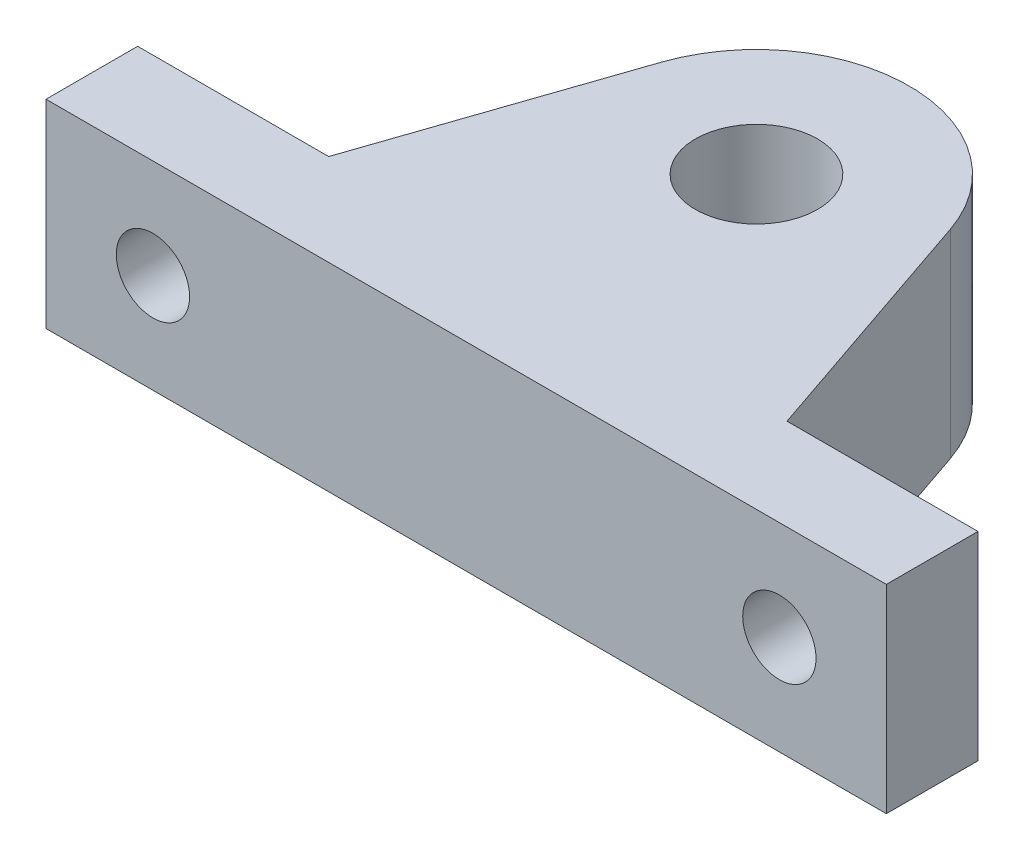
ISO-10303-21;
HEADER;
FILE_DESCRIPTION(('STEP AP214'),'2;1');
FILE_NAME('part.step','',(''),(''),'','','');
FILE_SCHEMA(('AUTOMOTIVE_DESIGN { 1 0 10303 214 1 1 1 1 }'));
ENDSEC;
DATA;
#1=APPLICATION_CONTEXT('core data for automotive mechanical design processes');
#2=APPLICATION_PROTOCOL_DEFINITION('international standard','automotive_design',2000,#1);
#3=PRODUCT_CONTEXT('',#1,'mechanical');
#4=PRODUCT('Part','Part','',(#3));
#5=PRODUCT_RELATED_PRODUCT_CATEGORY('part','',(#4));
#6=PRODUCT_DEFINITION_FORMATION('','',#4);
#7=PRODUCT_DEFINITION_CONTEXT('part definition',#1,'design');
#8=PRODUCT_DEFINITION('design','',#6,#7);
#9=PRODUCT_DEFINITION_SHAPE('','',#8);
#10=(LENGTH_UNIT() NAMED_UNIT(*) SI_UNIT(.MILLI.,.METRE.));
#11=(NAMED_UNIT(*) PLANE_ANGLE_UNIT() SI_UNIT($,.RADIAN.));
#12=(NAMED_UNIT(*) SI_UNIT($,.STERADIAN.) SOLID_ANGLE_UNIT());
#13=UNCERTAINTY_MEASURE_WITH_UNIT(LENGTH_MEASURE(1.E-05),#10,'distance_accuracy_value','');
#14=(GEOMETRIC_REPRESENTATION_CONTEXT(3) GLOBAL_UNCERTAINTY_ASSIGNED_CONTEXT((#13)) GLOBAL_UNIT_ASSIGNED_CONTEXT((#10,
#11,#12)) REPRESENTATION_CONTEXT('',''));
#15=CARTESIAN_POINT('',(0.,0.,0.));
#16=DIRECTION('',(0.,0.,1.));
#17=DIRECTION('',(1.,0.,0.));
#18=AXIS2_PLACEMENT_3D('',#15,#16,#17);
#19=CARTESIAN_POINT('',(0.,6.5,-16.));
#20=DIRECTION('',(0.,1.,0.));
#21=DIRECTION('',(0.,0.,1.));
#22=AXIS2_PLACEMENT_3D('',#19,#20,#21);
#23=PLANE('',#22);
#24=DIRECTION('',(-1.,0.,0.));
#25=VECTOR('',#24,1.);
#26=CARTESIAN_POINT('',(15.,6.5,-3.));
#27=LINE('',#26,#25);
#28=CARTESIAN_POINT('',(27.5,6.5,-3.));
#29=VERTEX_POINT('',#28);
#30=CARTESIAN_POINT('',(15.,6.5,-3.));
#31=VERTEX_POINT('',#30);
#32=EDGE_CURVE('E151',#29,#31,#27,.T.);
#33=ORIENTED_EDGE('',*,*,#32,.T.);
#34=DIRECTION('',(-0.322833560893994,0.,-0.946455752774795));
#35=VECTOR('',#34,1.);
#36=CARTESIAN_POINT('',(15.,6.5,-3.));
#37=LINE('',#36,#35);
#38=CARTESIAN_POINT('',(9.46455752774795,6.5,-19.2283356089399));
#39=VERTEX_POINT('',#38);
#40=EDGE_CURVE('E99',#31,#39,#37,.T.);
#41=ORIENTED_EDGE('',*,*,#40,.T.);
#42=CARTESIAN_POINT('',(0.,6.5,-16.));
#43=DIRECTION('',(0.,1.,0.));
#44=DIRECTION('',(0.,0.,1.));
#45=AXIS2_PLACEMENT_3D('',#42,#43,#44);
#46=CIRCLE('',#45,10.);
#47=CARTESIAN_POINT('',(-9.46455752774795,6.5,-19.2283356089399));
#48=VERTEX_POINT('',#47);
#49=EDGE_CURVE('E188',#39,#48,#46,.T.);
#50=ORIENTED_EDGE('',*,*,#49,.T.);
#51=DIRECTION('',(-0.322833560893994,0.,0.946455752774795));
#52=VECTOR('',#51,1.);
#53=CARTESIAN_POINT('',(-15.,6.5,-3.));
#54=LINE('',#53,#52);
#55=CARTESIAN_POINT('',(-15.,6.5,-3.));
#56=VERTEX_POINT('',#55);
#57=EDGE_CURVE('E190',#48,#56,#54,.T.);
#58=ORIENTED_EDGE('',*,*,#57,.T.);
#59=DIRECTION('',(-1.,0.,0.));
#60=VECTOR('',#59,1.);
#61=CARTESIAN_POINT('',(-27.5,6.5,-3.));
#62=LINE('',#61,#60);
#63=CARTESIAN_POINT('',(-27.5,6.5,-3.));
#64=VERTEX_POINT('',#63);
#65=EDGE_CURVE('E118',#56,#64,#62,.T.);
#66=ORIENTED_EDGE('',*,*,#65,.T.);
#67=DIRECTION('',(0.,0.,1.));
#68=VECTOR('',#67,1.);
#69=CARTESIAN_POINT('',(-27.5,6.5,3.));
#70=LINE('',#69,#68);
#71=CARTESIAN_POINT('',(-27.5,6.5,3.));
#72=VERTEX_POINT('',#71);
#73=EDGE_CURVE('E112',#64,#72,#70,.T.);
#74=ORIENTED_EDGE('',*,*,#73,.T.);
#75=DIRECTION('',(1.,0.,0.));
#76=VECTOR('',#75,1.);
#77=CARTESIAN_POINT('',(-27.5,6.5,3.));
#78=LINE('',#77,#76);
#79=CARTESIAN_POINT('',(27.5,6.5,3.));
#80=VERTEX_POINT('',#79);
#81=EDGE_CURVE('E116',#72,#80,#78,.T.);
#82=ORIENTED_EDGE('',*,*,#81,.T.);
#83=DIRECTION('',(0.,0.,-1.));
#84=VECTOR('',#83,1.);
#85=CARTESIAN_POINT('',(27.5,6.5,3.));
#86=LINE('',#85,#84);
#87=EDGE_CURVE('E56',#80,#29,#86,.T.);
#88=ORIENTED_EDGE('',*,*,#87,.T.);
#89=EDGE_LOOP('',(#33,#41,#50,#58,#66,#74,#82,#88));
#90=FACE_BOUND('',#89,.T.);
#91=CARTESIAN_POINT('',(0.,6.5,-16.));
#92=DIRECTION('',(0.,1.,0.));
#93=DIRECTION('',(0.,0.,1.));
#94=AXIS2_PLACEMENT_3D('',#91,#92,#93);
#95=CIRCLE('',#94,4.);
#96=CARTESIAN_POINT('',(0.,6.5,-20.));
#97=VERTEX_POINT('',#96);
#98=EDGE_CURVE('E140',#97,#97,#95,.T.);
#99=ORIENTED_EDGE('',*,*,#98,.F.);
#100=EDGE_LOOP('',(#99));
#101=FACE_BOUND('',#100,.T.);
#102=ADVANCED_FACE('F37',(#90,#101),#23,.T.);
#103=CARTESIAN_POINT('',(0.,-6.5,-16.));
#104=DIRECTION('',(0.,1.,0.));
#105=DIRECTION('',(0.,0.,1.));
#106=AXIS2_PLACEMENT_3D('',#103,#104,#105);
#107=PLANE('',#106);
#108=CARTESIAN_POINT('',(0.,-6.5,-16.));
#109=DIRECTION('',(0.,1.,0.));
#110=DIRECTION('',(0.,0.,1.));
#111=AXIS2_PLACEMENT_3D('',#108,#109,#110);
#112=CIRCLE('',#111,6.5);
#113=CARTESIAN_POINT('',(0.,-6.5,-9.5));
#114=VERTEX_POINT('',#113);
#115=EDGE_CURVE('E163',#114,#114,#112,.T.);
#116=ORIENTED_EDGE('',*,*,#115,.T.);
#117=EDGE_LOOP('',(#116));
#118=FACE_BOUND('',#117,.T.);
#119=DIRECTION('',(-1.,0.,0.));
#120=VECTOR('',#119,1.);
#121=CARTESIAN_POINT('',(15.,-6.5,-3.));
#122=LINE('',#121,#120);
#123=CARTESIAN_POINT('',(27.5,-6.5,-3.));
#124=VERTEX_POINT('',#123);
#125=CARTESIAN_POINT('',(15.,-6.5,-3.));
#126=VERTEX_POINT('',#125);
#127=EDGE_CURVE('E136',#124,#126,#122,.T.);
#128=ORIENTED_EDGE('',*,*,#127,.F.);
#129=DIRECTION('',(0.,0.,-1.));
#130=VECTOR('',#129,1.);
#131=CARTESIAN_POINT('',(27.5,-6.5,3.));
#132=LINE('',#131,#130);
#133=CARTESIAN_POINT('',(27.5,-6.5,3.));
#134=VERTEX_POINT('',#133);
#135=EDGE_CURVE('E91',#134,#124,#132,.T.);
#136=ORIENTED_EDGE('',*,*,#135,.F.);
#137=DIRECTION('',(1.,0.,0.));
#138=VECTOR('',#137,1.);
#139=CARTESIAN_POINT('',(-27.5,-6.5,3.));
#140=LINE('',#139,#138);
#141=CARTESIAN_POINT('',(-27.5,-6.5,3.));
#142=VERTEX_POINT('',#141);
#143=EDGE_CURVE('E85',#142,#134,#140,.T.);
#144=ORIENTED_EDGE('',*,*,#143,.F.);
#145=DIRECTION('',(0.,0.,1.));
#146=VECTOR('',#145,1.);
#147=CARTESIAN_POINT('',(-27.5,-6.5,3.));
#148=LINE('',#147,#146);
#149=CARTESIAN_POINT('',(-27.5,-6.5,-3.));
#150=VERTEX_POINT('',#149);
#151=EDGE_CURVE('E126',#150,#142,#148,.T.);
#152=ORIENTED_EDGE('',*,*,#151,.F.);
#153=DIRECTION('',(-1.,0.,0.));
#154=VECTOR('',#153,1.);
#155=CARTESIAN_POINT('',(-27.5,-6.5,-3.));
#156=LINE('',#155,#154);
#157=CARTESIAN_POINT('',(-15.,-6.5,-3.));
#158=VERTEX_POINT('',#157);
#159=EDGE_CURVE('E146',#158,#150,#156,.T.);
#160=ORIENTED_EDGE('',*,*,#159,.F.);
#161=DIRECTION('',(-0.322833560893994,0.,0.946455752774795));
#162=VECTOR('',#161,1.);
#163=CARTESIAN_POINT('',(-15.,-6.5,-3.));
#164=LINE('',#163,#162);
#165=CARTESIAN_POINT('',(-9.46455752774795,-6.5,-19.2283356089399));
#166=VERTEX_POINT('',#165);
#167=EDGE_CURVE('E144',#166,#158,#164,.T.);
#168=ORIENTED_EDGE('',*,*,#167,.F.);
#169=CARTESIAN_POINT('',(0.,-6.5,-16.));
#170=DIRECTION('',(0.,1.,0.));
#171=DIRECTION('',(0.,0.,1.));
#172=AXIS2_PLACEMENT_3D('',#169,#170,#171);
#173=CIRCLE('',#172,10.);
#174=CARTESIAN_POINT('',(9.46455752774795,-6.5,-19.2283356089399));
#175=VERTEX_POINT('',#174);
#176=EDGE_CURVE('E142',#175,#166,#173,.T.);
#177=ORIENTED_EDGE('',*,*,#176,.F.);
#178=DIRECTION('',(-0.322833560893994,0.,-0.946455752774795));
#179=VECTOR('',#178,1.);
#180=CARTESIAN_POINT('',(15.,-6.5,-3.));
#181=LINE('',#180,#179);
#182=EDGE_CURVE('E139',#126,#175,#181,.T.);
#183=ORIENTED_EDGE('',*,*,#182,.F.);
#184=EDGE_LOOP('',(#128,#136,#144,#152,#160,#168,#177,#183));
#185=FACE_BOUND('',#184,.T.);
#186=ADVANCED_FACE('F203',(#118,#185),#107,.F.);
#187=CARTESIAN_POINT('',(15.,6.5,-3.));
#188=DIRECTION('',(0.,0.,1.));
#189=DIRECTION('',(1.,0.,0.));
#190=AXIS2_PLACEMENT_3D('',#187,#188,#189);
#191=PLANE('',#190);
#192=CARTESIAN_POINT('',(20.5,0.,-3.));
#193=DIRECTION('',(0.,0.,-1.));
#194=DIRECTION('',(-1.,0.,0.));
#195=AXIS2_PLACEMENT_3D('',#192,#193,#194);
#196=CIRCLE('',#195,2.4);
#197=CARTESIAN_POINT('',(18.1,0.,-3.));
#198=VERTEX_POINT('',#197);
#199=EDGE_CURVE('E173',#198,#198,#196,.T.);
#200=ORIENTED_EDGE('',*,*,#199,.F.);
#201=EDGE_LOOP('',(#200));
#202=FACE_BOUND('',#201,.T.);
#203=ORIENTED_EDGE('',*,*,#127,.T.);
#204=DIRECTION('',(0.,-1.,0.));
#205=VECTOR('',#204,1.);
#206=CARTESIAN_POINT('',(15.,6.5,-3.));
#207=LINE('',#206,#205);
#208=EDGE_CURVE('E11',#31,#126,#207,.T.);
#209=ORIENTED_EDGE('',*,*,#208,.F.);
#210=ORIENTED_EDGE('',*,*,#32,.F.);
#211=DIRECTION('',(0.,-1.,0.));
#212=VECTOR('',#211,1.);
#213=CARTESIAN_POINT('',(27.5,6.5,-3.));
#214=LINE('',#213,#212);
#215=EDGE_CURVE('E132',#29,#124,#214,.T.);
#216=ORIENTED_EDGE('',*,*,#215,.T.);
#217=EDGE_LOOP('',(#203,#209,#210,#216));
#218=FACE_BOUND('',#217,.T.);
#219=ADVANCED_FACE('F39',(#202,#218),#191,.F.);
#220=CARTESIAN_POINT('',(15.,6.5,-3.));
#221=DIRECTION('',(-0.946455752774795,0.,0.322833560893994));
#222=DIRECTION('',(0.322833560893994,0.,0.946455752774795));
#223=AXIS2_PLACEMENT_3D('',#220,#221,#222);
#224=PLANE('',#223);
#225=ORIENTED_EDGE('',*,*,#182,.T.);
#226=DIRECTION('',(0.,-1.,0.));
#227=VECTOR('',#226,1.);
#228=CARTESIAN_POINT('',(9.46455752774795,6.5,-19.2283356089399));
#229=LINE('',#228,#227);
#230=EDGE_CURVE('E47',#39,#175,#229,.T.);
#231=ORIENTED_EDGE('',*,*,#230,.F.);
#232=ORIENTED_EDGE('',*,*,#40,.F.);
#233=ORIENTED_EDGE('',*,*,#208,.T.);
#234=EDGE_LOOP('',(#225,#231,#232,#233));
#235=FACE_BOUND('',#234,.T.);
#236=ADVANCED_FACE('F317',(#235),#224,.F.);
#237=CARTESIAN_POINT('',(0.,6.5,-16.));
#238=DIRECTION('',(0.,-1.,0.));
#239=DIRECTION('',(0.,0.,-1.));
#240=AXIS2_PLACEMENT_3D('',#237,#238,#239);
#241=CYLINDRICAL_SURFACE('',#240,10.);
#242=ORIENTED_EDGE('',*,*,#176,.T.);
#243=DIRECTION('',(0.,-1.,0.));
#244=VECTOR('',#243,1.);
#245=CARTESIAN_POINT('',(-9.46455752774795,6.5,-19.2283356089399));
#246=LINE('',#245,#244);
#247=EDGE_CURVE('E158',#48,#166,#246,.T.);
#248=ORIENTED_EDGE('',*,*,#247,.F.);
#249=ORIENTED_EDGE('',*,*,#49,.F.);
#250=ORIENTED_EDGE('',*,*,#230,.T.);
#251=EDGE_LOOP('',(#242,#248,#249,#250));
#252=FACE_BOUND('',#251,.T.);
#253=ADVANCED_FACE('F309',(#252),#241,.T.);
#254=CARTESIAN_POINT('',(-15.,6.5,-3.));
#255=DIRECTION('',(0.946455752774795,0.,0.322833560893994));
#256=DIRECTION('',(0.322833560893994,0.,-0.946455752774795));
#257=AXIS2_PLACEMENT_3D('',#254,#255,#256);
#258=PLANE('',#257);
#259=ORIENTED_EDGE('',*,*,#167,.T.);
#260=DIRECTION('',(0.,-1.,0.));
#261=VECTOR('',#260,1.);
#262=CARTESIAN_POINT('',(-15.,6.5,-3.));
#263=LINE('',#262,#261);
#264=EDGE_CURVE('E155',#56,#158,#263,.T.);
#265=ORIENTED_EDGE('',*,*,#264,.F.);
#266=ORIENTED_EDGE('',*,*,#57,.F.);
#267=ORIENTED_EDGE('',*,*,#247,.T.);
#268=EDGE_LOOP('',(#259,#265,#266,#267));
#269=FACE_BOUND('',#268,.T.);
#270=ADVANCED_FACE('F196',(#269),#258,.F.);
#271=CARTESIAN_POINT('',(-27.5,6.5,-3.));
#272=DIRECTION('',(0.,0.,1.));
#273=DIRECTION('',(1.,0.,0.));
#274=AXIS2_PLACEMENT_3D('',#271,#272,#273);
#275=PLANE('',#274);
#276=CARTESIAN_POINT('',(-20.5,0.,-3.));
#277=DIRECTION('',(0.,0.,-1.));
#278=DIRECTION('',(-1.,0.,0.));
#279=AXIS2_PLACEMENT_3D('',#276,#277,#278);
#280=CIRCLE('',#279,2.4);
#281=CARTESIAN_POINT('',(-22.9,0.,-3.));
#282=VERTEX_POINT('',#281);
#283=EDGE_CURVE('E168',#282,#282,#280,.T.);
#284=ORIENTED_EDGE('',*,*,#283,.F.);
#285=EDGE_LOOP('',(#284));
#286=FACE_BOUND('',#285,.T.);
#287=ORIENTED_EDGE('',*,*,#159,.T.);
#288=DIRECTION('',(0.,-1.,0.));
#289=VECTOR('',#288,1.);
#290=CARTESIAN_POINT('',(-27.5,6.5,-3.));
#291=LINE('',#290,#289);
#292=EDGE_CURVE('E127',#64,#150,#291,.T.);
#293=ORIENTED_EDGE('',*,*,#292,.F.);
#294=ORIENTED_EDGE('',*,*,#65,.F.);
#295=ORIENTED_EDGE('',*,*,#264,.T.);
#296=EDGE_LOOP('',(#287,#293,#294,#295));
#297=FACE_BOUND('',#296,.T.);
#298=ADVANCED_FACE('F200',(#286,#297),#275,.F.);
#299=CARTESIAN_POINT('',(-27.5,6.5,3.));
#300=DIRECTION('',(1.,0.,0.));
#301=DIRECTION('',(0.,0.,-1.));
#302=AXIS2_PLACEMENT_3D('',#299,#300,#301);
#303=PLANE('',#302);
#304=ORIENTED_EDGE('',*,*,#151,.T.);
#305=DIRECTION('',(0.,-1.,0.));
#306=VECTOR('',#305,1.);
#307=CARTESIAN_POINT('',(-27.5,6.5,3.));
#308=LINE('',#307,#306);
#309=EDGE_CURVE('E123',#72,#142,#308,.T.);
#310=ORIENTED_EDGE('',*,*,#309,.F.);
#311=ORIENTED_EDGE('',*,*,#73,.F.);
#312=ORIENTED_EDGE('',*,*,#292,.T.);
#313=EDGE_LOOP('',(#304,#310,#311,#312));
#314=FACE_BOUND('',#313,.T.);
#315=ADVANCED_FACE('F124',(#314),#303,.F.);
#316=CARTESIAN_POINT('',(-27.5,6.5,3.));
#317=DIRECTION('',(0.,0.,-1.));
#318=DIRECTION('',(-1.,0.,0.));
#319=AXIS2_PLACEMENT_3D('',#316,#317,#318);
#320=PLANE('',#319);
#321=CARTESIAN_POINT('',(-20.5,0.,3.));
#322=DIRECTION('',(0.,0.,-1.));
#323=DIRECTION('',(-1.,0.,0.));
#324=AXIS2_PLACEMENT_3D('',#321,#322,#323);
#325=CIRCLE('',#324,2.4);
#326=CARTESIAN_POINT('',(-22.9,0.,3.));
#327=VERTEX_POINT('',#326);
#328=EDGE_CURVE('E41',#327,#327,#325,.T.);
#329=ORIENTED_EDGE('',*,*,#328,.T.);
#330=EDGE_LOOP('',(#329));
#331=FACE_BOUND('',#330,.T.);
#332=CARTESIAN_POINT('',(20.5,0.,3.));
#333=DIRECTION('',(0.,0.,-1.));
#334=DIRECTION('',(-1.,0.,0.));
#335=AXIS2_PLACEMENT_3D('',#332,#333,#334);
#336=CIRCLE('',#335,2.4);
#337=CARTESIAN_POINT('',(18.1,0.,3.));
#338=VERTEX_POINT('',#337);
#339=EDGE_CURVE('E166',#338,#338,#336,.T.);
#340=ORIENTED_EDGE('',*,*,#339,.T.);
#341=EDGE_LOOP('',(#340));
#342=FACE_BOUND('',#341,.T.);
#343=ORIENTED_EDGE('',*,*,#143,.T.);
#344=DIRECTION('',(0.,-1.,0.));
#345=VECTOR('',#344,1.);
#346=CARTESIAN_POINT('',(27.5,6.5,3.));
#347=LINE('',#346,#345);
#348=EDGE_CURVE('E128',#80,#134,#347,.T.);
#349=ORIENTED_EDGE('',*,*,#348,.F.);
#350=ORIENTED_EDGE('',*,*,#81,.F.);
#351=ORIENTED_EDGE('',*,*,#309,.T.);
#352=EDGE_LOOP('',(#343,#349,#350,#351));
#353=FACE_BOUND('',#352,.T.);
#354=ADVANCED_FACE('F130',(#331,#342,#353),#320,.F.);
#355=CARTESIAN_POINT('',(27.5,6.5,3.));
#356=DIRECTION('',(-1.,0.,0.));
#357=DIRECTION('',(0.,0.,1.));
#358=AXIS2_PLACEMENT_3D('',#355,#356,#357);
#359=PLANE('',#358);
#360=ORIENTED_EDGE('',*,*,#135,.T.);
#361=ORIENTED_EDGE('',*,*,#215,.F.);
#362=ORIENTED_EDGE('',*,*,#87,.F.);
#363=ORIENTED_EDGE('',*,*,#348,.T.);
#364=EDGE_LOOP('',(#360,#361,#362,#363));
#365=FACE_BOUND('',#364,.T.);
#366=ADVANCED_FACE('F208',(#365),#359,.F.);
#367=CARTESIAN_POINT('',(0.,6.5,-16.));
#368=DIRECTION('',(0.,-1.,0.));
#369=DIRECTION('',(0.,0.,-1.));
#370=AXIS2_PLACEMENT_3D('',#367,#368,#369);
#371=CYLINDRICAL_SURFACE('',#370,4.);
#372=CARTESIAN_POINT('',(0.,-8.5,-16.));
#373=DIRECTION('',(0.,1.,0.));
#374=DIRECTION('',(0.,0.,1.));
#375=AXIS2_PLACEMENT_3D('',#372,#373,#374);
#376=CIRCLE('',#375,4.);
#377=CARTESIAN_POINT('',(0.,-8.5,-20.));
#378=VERTEX_POINT('',#377);
#379=EDGE_CURVE('E178',#378,#378,#376,.T.);
#380=CARTESIAN_POINT('',(0.,6.5,-20.));
#381=CARTESIAN_POINT('',(0.,6.34375,-20.));
#382=CARTESIAN_POINT('',(0.,6.1875,-20.));
#383=CARTESIAN_POINT('',(0.,5.875,-20.));
#384=CARTESIAN_POINT('',(0.,5.71875,-20.));
#385=CARTESIAN_POINT('',(0.,5.40625,-20.));
#386=CARTESIAN_POINT('',(0.,5.25,-20.));
#387=CARTESIAN_POINT('',(0.,4.9375,-20.));
#388=CARTESIAN_POINT('',(0.,4.78125,-20.));
#389=CARTESIAN_POINT('',(0.,4.46875,-20.));
#390=CARTESIAN_POINT('',(0.,4.3125,-20.));
#391=CARTESIAN_POINT('',(0.,4.,-20.));
#392=CARTESIAN_POINT('',(0.,3.84375,-20.));
#393=CARTESIAN_POINT('',(0.,3.53125,-20.));
#394=CARTESIAN_POINT('',(0.,3.375,-20.));
#395=CARTESIAN_POINT('',(0.,3.0625,-20.));
#396=CARTESIAN_POINT('',(0.,2.90625,-20.));
#397=CARTESIAN_POINT('',(0.,2.59375,-20.));
#398=CARTESIAN_POINT('',(0.,2.4375,-20.));
#399=CARTESIAN_POINT('',(0.,2.125,-20.));
#400=CARTESIAN_POINT('',(0.,1.96875,-20.));
#401=CARTESIAN_POINT('',(0.,1.65625,-20.));
#402=CARTESIAN_POINT('',(0.,1.5,-20.));
#403=CARTESIAN_POINT('',(0.,1.1875,-20.));
#404=CARTESIAN_POINT('',(0.,1.03125,-20.));
#405=CARTESIAN_POINT('',(0.,0.718749999999999,-20.));
#406=CARTESIAN_POINT('',(0.,0.562499999999999,-20.));
#407=CARTESIAN_POINT('',(0.,0.249999999999999,-20.));
#408=CARTESIAN_POINT('',(0.,0.0937499999999992,-20.));
#409=CARTESIAN_POINT('',(0.,-0.218750000000001,-20.));
#410=CARTESIAN_POINT('',(0.,-0.375000000000001,-20.));
#411=CARTESIAN_POINT('',(0.,-0.687500000000001,-20.));
#412=CARTESIAN_POINT('',(0.,-0.843750000000001,-20.));
#413=CARTESIAN_POINT('',(0.,-1.15625,-20.));
#414=CARTESIAN_POINT('',(0.,-1.3125,-20.));
#415=CARTESIAN_POINT('',(0.,-1.625,-20.));
#416=CARTESIAN_POINT('',(0.,-1.78125,-20.));
#417=CARTESIAN_POINT('',(0.,-2.09375,-20.));
#418=CARTESIAN_POINT('',(0.,-2.25,-20.));
#419=CARTESIAN_POINT('',(0.,-2.5625,-20.));
#420=CARTESIAN_POINT('',(0.,-2.71875,-20.));
#421=CARTESIAN_POINT('',(0.,-3.03125,-20.));
#422=CARTESIAN_POINT('',(0.,-3.1875,-20.));
#423=CARTESIAN_POINT('',(0.,-3.5,-20.));
#424=CARTESIAN_POINT('',(0.,-3.65625,-20.));
#425=CARTESIAN_POINT('',(0.,-3.96875,-20.));
#426=CARTESIAN_POINT('',(0.,-4.125,-20.));
#427=CARTESIAN_POINT('',(0.,-4.4375,-20.));
#428=CARTESIAN_POINT('',(0.,-4.59375,-20.));
#429=CARTESIAN_POINT('',(0.,-4.90625,-20.));
#430=CARTESIAN_POINT('',(0.,-5.0625,-20.));
#431=CARTESIAN_POINT('',(0.,-5.375,-20.));
#432=CARTESIAN_POINT('',(0.,-5.53125,-20.));
#433=CARTESIAN_POINT('',(0.,-5.84375,-20.));
#434=CARTESIAN_POINT('',(0.,-6.,-20.));
#435=CARTESIAN_POINT('',(0.,-6.3125,-20.));
#436=CARTESIAN_POINT('',(0.,-6.46875,-20.));
#437=CARTESIAN_POINT('',(0.,-6.78125,-20.));
#438=CARTESIAN_POINT('',(0.,-6.9375,-20.));
#439=CARTESIAN_POINT('',(0.,-7.25,-20.));
#440=CARTESIAN_POINT('',(0.,-7.40625,-20.));
#441=CARTESIAN_POINT('',(0.,-7.71875,-20.));
#442=CARTESIAN_POINT('',(0.,-7.875,-20.));
#443=CARTESIAN_POINT('',(0.,-8.1875,-20.));
#444=CARTESIAN_POINT('',(0.,-8.34375,-20.));
#445=CARTESIAN_POINT('',(0.,-8.5,-20.));
#446=B_SPLINE_CURVE_WITH_KNOTS('',3,(#380,#381,#382,#383,#384,#385,#386,#387,#388,#389,#390,
#391,#392,#393,#394,#395,#396,#397,#398,#399,#400,#401,#402,#403,#404,#405,#406,#407,#408,#409,
#410,#411,#412,#413,#414,#415,#416,#417,#418,#419,#420,#421,#422,#423,#424,#425,#426,#427,#428,
#429,#430,#431,#432,#433,#434,#435,#436,#437,#438,#439,#440,#441,#442,#443,#444,#445),
.UNSPECIFIED.,.F.,.F.,(4,2,2,2,2,2,2,2,2,2,2,2,2,2,2,2,2,2,2,2,2,2,2,2,2,2,2,2,2,2,2,2,4),(0.,
0.46875,0.937500000000001,1.40625,1.875,2.34375,2.8125,3.28125,3.75,4.21875,4.6875,5.15625,
5.625,6.09375,6.5625,7.03125,7.5,7.96875,8.4375,8.90625,9.375,9.84375,10.3125,10.78125,11.25,
11.71875,12.1875,12.65625,13.125,13.59375,14.0625,14.53125,15.),.UNSPECIFIED.);
#447=EDGE_CURVE('BSEAM210',#97,#378,#446,.T.);
#448=ORIENTED_EDGE('',*,*,#98,.T.);
#449=ORIENTED_EDGE('',*,*,#379,.F.);
#450=ORIENTED_EDGE('',*,*,#447,.T.);
#451=ORIENTED_EDGE('',*,*,#447,.F.);
#452=EDGE_LOOP('',(#448,#450,#449,#451));
#453=FACE_BOUND('',#452,.T.);
#454=ADVANCED_FACE('F210',(#453),#371,.F.);
#455=CARTESIAN_POINT('',(0.,-8.5,-16.));
#456=DIRECTION('',(0.,1.,0.));
#457=DIRECTION('',(0.,0.,1.));
#458=AXIS2_PLACEMENT_3D('',#455,#456,#457);
#459=CYLINDRICAL_SURFACE('',#458,6.5);
#460=CARTESIAN_POINT('',(0.,-8.5,-16.));
#461=DIRECTION('',(0.,1.,0.));
#462=DIRECTION('',(0.,0.,1.));
#463=AXIS2_PLACEMENT_3D('',#460,#461,#462);
#464=CIRCLE('',#463,6.5);
#465=CARTESIAN_POINT('',(0.,-8.5,-9.5));
#466=VERTEX_POINT('',#465);
#467=EDGE_CURVE('E165',#466,#466,#464,.T.);
#468=ORIENTED_EDGE('',*,*,#467,.T.);
#469=EDGE_LOOP('',(#468));
#470=FACE_BOUND('',#469,.T.);
#471=ORIENTED_EDGE('',*,*,#115,.F.);
#472=EDGE_LOOP('',(#471));
#473=FACE_BOUND('',#472,.T.);
#474=ADVANCED_FACE('F216',(#470,#473),#459,.T.);
#475=CARTESIAN_POINT('',(0.,-8.5,-16.));
#476=DIRECTION('',(0.,1.,0.));
#477=DIRECTION('',(0.,0.,1.));
#478=AXIS2_PLACEMENT_3D('',#475,#476,#477);
#479=PLANE('',#478);
#480=ORIENTED_EDGE('',*,*,#379,.T.);
#481=EDGE_LOOP('',(#480));
#482=FACE_BOUND('',#481,.T.);
#483=ORIENTED_EDGE('',*,*,#467,.F.);
#484=EDGE_LOOP('',(#483));
#485=FACE_BOUND('',#484,.T.);
#486=ADVANCED_FACE('F231',(#482,#485),#479,.F.);
#487=CARTESIAN_POINT('',(20.5,0.,13.));
#488=DIRECTION('',(0.,0.,-1.));
#489=DIRECTION('',(-1.,0.,0.));
#490=AXIS2_PLACEMENT_3D('',#487,#488,#489);
#491=CYLINDRICAL_SURFACE('',#490,2.4);
#492=ORIENTED_EDGE('',*,*,#199,.T.);
#493=EDGE_LOOP('',(#492));
#494=FACE_BOUND('',#493,.T.);
#495=ORIENTED_EDGE('',*,*,#339,.F.);
#496=EDGE_LOOP('',(#495));
#497=FACE_BOUND('',#496,.T.);
#498=ADVANCED_FACE('F235',(#494,#497),#491,.F.);
#499=CARTESIAN_POINT('',(-20.5,0.,13.));
#500=DIRECTION('',(0.,0.,-1.));
#501=DIRECTION('',(-1.,0.,0.));
#502=AXIS2_PLACEMENT_3D('',#499,#500,#501);
#503=CYLINDRICAL_SURFACE('',#502,2.4);
#504=ORIENTED_EDGE('',*,*,#283,.T.);
#505=EDGE_LOOP('',(#504));
#506=FACE_BOUND('',#505,.T.);
#507=ORIENTED_EDGE('',*,*,#328,.F.);
#508=EDGE_LOOP('',(#507));
#509=FACE_BOUND('',#508,.T.);
#510=ADVANCED_FACE('F239',(#506,#509),#503,.F.);
#511=CLOSED_SHELL('',(#102,#186,#219,#236,#253,#270,#298,#315,#354,#366,#454,#474,#486,#498,#510));
#512=MANIFOLD_SOLID_BREP('B2',#511);
#513=ADVANCED_BREP_SHAPE_REPRESENTATION('',(#18,#512),#14);
#514=SHAPE_DEFINITION_REPRESENTATION(#9,#513);
ENDSEC;
END-ISO-10303-21;
